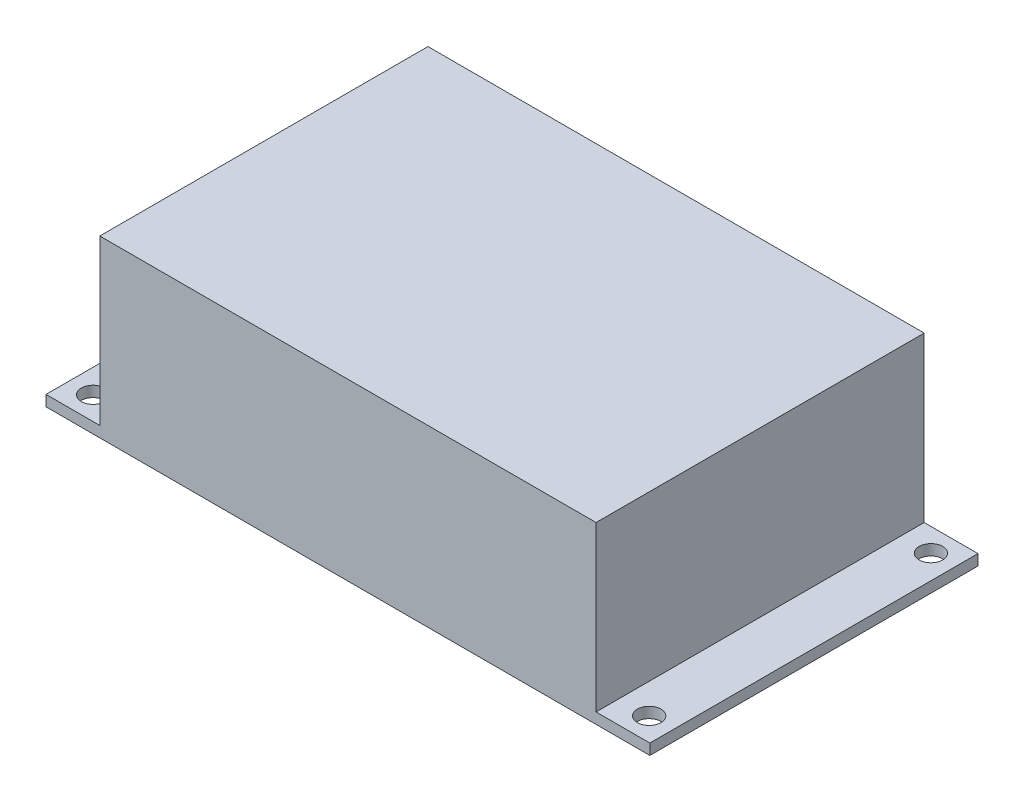
ISO-10303-21;
HEADER;
FILE_DESCRIPTION(('STEP AP214'),'2;1');
FILE_NAME('part.step','',(''),(''),'','','');
FILE_SCHEMA(('AUTOMOTIVE_DESIGN { 1 0 10303 214 1 1 1 1 }'));
ENDSEC;
DATA;
#1=APPLICATION_CONTEXT('core data for automotive mechanical design processes');
#2=APPLICATION_PROTOCOL_DEFINITION('international standard','automotive_design',2000,#1);
#3=PRODUCT_CONTEXT('',#1,'mechanical');
#4=PRODUCT('Part','Part','',(#3));
#5=PRODUCT_RELATED_PRODUCT_CATEGORY('part','',(#4));
#6=PRODUCT_DEFINITION_FORMATION('','',#4);
#7=PRODUCT_DEFINITION_CONTEXT('part definition',#1,'design');
#8=PRODUCT_DEFINITION('design','',#6,#7);
#9=PRODUCT_DEFINITION_SHAPE('','',#8);
#10=(LENGTH_UNIT() NAMED_UNIT(*) SI_UNIT(.MILLI.,.METRE.));
#11=(NAMED_UNIT(*) PLANE_ANGLE_UNIT() SI_UNIT($,.RADIAN.));
#12=(NAMED_UNIT(*) SI_UNIT($,.STERADIAN.) SOLID_ANGLE_UNIT());
#13=UNCERTAINTY_MEASURE_WITH_UNIT(LENGTH_MEASURE(1.E-05),#10,'distance_accuracy_value','');
#14=(GEOMETRIC_REPRESENTATION_CONTEXT(3) GLOBAL_UNCERTAINTY_ASSIGNED_CONTEXT((#13)) GLOBAL_UNIT_ASSIGNED_CONTEXT((#10,
#11,#12)) REPRESENTATION_CONTEXT('',''));
#15=CARTESIAN_POINT('',(0.,0.,0.));
#16=DIRECTION('',(0.,0.,1.));
#17=DIRECTION('',(1.,0.,0.));
#18=AXIS2_PLACEMENT_3D('',#15,#16,#17);
#19=CARTESIAN_POINT('',(0.,1.6,0.));
#20=DIRECTION('',(0.,1.,0.));
#21=DIRECTION('',(0.,0.,1.));
#22=AXIS2_PLACEMENT_3D('',#19,#20,#21);
#23=PLANE('',#22);
#24=DIRECTION('',(0.,0.,1.));
#25=VECTOR('',#24,1.);
#26=CARTESIAN_POINT('',(-36.9,1.6,-24.4));
#27=LINE('',#26,#25);
#28=CARTESIAN_POINT('',(-36.9,1.6,-24.4));
#29=VERTEX_POINT('',#28);
#30=CARTESIAN_POINT('',(-36.9,1.6,24.4));
#31=VERTEX_POINT('',#30);
#32=EDGE_CURVE('E51',#29,#31,#27,.T.);
#33=ORIENTED_EDGE('',*,*,#32,.F.);
#34=DIRECTION('',(-1.,0.,0.));
#35=VECTOR('',#34,1.);
#36=CARTESIAN_POINT('',(-44.9,1.6,-24.4));
#37=LINE('',#36,#35);
#38=CARTESIAN_POINT('',(-44.9,1.6,-24.4));
#39=VERTEX_POINT('',#38);
#40=EDGE_CURVE('E188',#29,#39,#37,.T.);
#41=ORIENTED_EDGE('',*,*,#40,.T.);
#42=DIRECTION('',(0.,0.,1.));
#43=VECTOR('',#42,1.);
#44=CARTESIAN_POINT('',(-44.9,1.6,-24.4));
#45=LINE('',#44,#43);
#46=CARTESIAN_POINT('',(-44.9,1.6,24.4));
#47=VERTEX_POINT('',#46);
#48=EDGE_CURVE('E155',#39,#47,#45,.T.);
#49=ORIENTED_EDGE('',*,*,#48,.T.);
#50=DIRECTION('',(1.,0.,0.));
#51=VECTOR('',#50,1.);
#52=CARTESIAN_POINT('',(-44.9,1.6,24.4));
#53=LINE('',#52,#51);
#54=EDGE_CURVE('E168',#47,#31,#53,.T.);
#55=ORIENTED_EDGE('',*,*,#54,.T.);
#56=EDGE_LOOP('',(#33,#41,#49,#55));
#57=FACE_BOUND('',#56,.T.);
#58=CARTESIAN_POINT('',(-41.35,1.6,-20.95));
#59=DIRECTION('',(0.,1.,0.));
#60=DIRECTION('',(0.,0.,1.));
#61=AXIS2_PLACEMENT_3D('',#58,#59,#60);
#62=CIRCLE('',#61,1.75);
#63=CARTESIAN_POINT('',(-41.35,1.6,-19.2));
#64=VERTEX_POINT('',#63);
#65=EDGE_CURVE('E146',#64,#64,#62,.T.);
#66=ORIENTED_EDGE('',*,*,#65,.F.);
#67=EDGE_LOOP('',(#66));
#68=FACE_BOUND('',#67,.T.);
#69=CARTESIAN_POINT('',(-41.35,1.6,20.95));
#70=DIRECTION('',(0.,1.,0.));
#71=DIRECTION('',(0.,0.,-1.));
#72=AXIS2_PLACEMENT_3D('',#69,#70,#71);
#73=CIRCLE('',#72,1.75);
#74=CARTESIAN_POINT('',(-41.35,1.6,19.2));
#75=VERTEX_POINT('',#74);
#76=EDGE_CURVE('E140',#75,#75,#73,.T.);
#77=ORIENTED_EDGE('',*,*,#76,.F.);
#78=EDGE_LOOP('',(#77));
#79=FACE_BOUND('',#78,.T.);
#80=ADVANCED_FACE('F34',(#57,#68,#79),#23,.T.);
#81=CARTESIAN_POINT('',(-44.9,1.6,-24.4));
#82=DIRECTION('',(1.,0.,0.));
#83=DIRECTION('',(0.,0.,-1.));
#84=AXIS2_PLACEMENT_3D('',#81,#82,#83);
#85=PLANE('',#84);
#86=DIRECTION('',(0.,0.,1.));
#87=VECTOR('',#86,1.);
#88=CARTESIAN_POINT('',(-44.9,0.,-24.4));
#89=LINE('',#88,#87);
#90=CARTESIAN_POINT('',(-44.9,0.,-24.4));
#91=VERTEX_POINT('',#90);
#92=CARTESIAN_POINT('',(-44.9,0.,24.4));
#93=VERTEX_POINT('',#92);
#94=EDGE_CURVE('E152',#91,#93,#89,.T.);
#95=ORIENTED_EDGE('',*,*,#94,.T.);
#96=DIRECTION('',(0.,-1.,0.));
#97=VECTOR('',#96,1.);
#98=CARTESIAN_POINT('',(-44.9,1.6,24.4));
#99=LINE('',#98,#97);
#100=EDGE_CURVE('E12',#47,#93,#99,.T.);
#101=ORIENTED_EDGE('',*,*,#100,.F.);
#102=ORIENTED_EDGE('',*,*,#48,.F.);
#103=DIRECTION('',(0.,-1.,0.));
#104=VECTOR('',#103,1.);
#105=CARTESIAN_POINT('',(-44.9,1.6,-24.4));
#106=LINE('',#105,#104);
#107=EDGE_CURVE('E175',#39,#91,#106,.T.);
#108=ORIENTED_EDGE('',*,*,#107,.T.);
#109=EDGE_LOOP('',(#95,#101,#102,#108));
#110=FACE_BOUND('',#109,.T.);
#111=ADVANCED_FACE('F36',(#110),#85,.F.);
#112=CARTESIAN_POINT('',(-44.9,1.6,24.4));
#113=DIRECTION('',(0.,0.,-1.));
#114=DIRECTION('',(-1.,0.,0.));
#115=AXIS2_PLACEMENT_3D('',#112,#113,#114);
#116=PLANE('',#115);
#117=DIRECTION('',(1.,0.,0.));
#118=VECTOR('',#117,1.);
#119=CARTESIAN_POINT('',(-44.9,0.,24.4));
#120=LINE('',#119,#118);
#121=CARTESIAN_POINT('',(44.9,0.,24.4));
#122=VERTEX_POINT('',#121);
#123=EDGE_CURVE('E182',#93,#122,#120,.T.);
#124=ORIENTED_EDGE('',*,*,#123,.T.);
#125=DIRECTION('',(0.,-1.,0.));
#126=VECTOR('',#125,1.);
#127=CARTESIAN_POINT('',(44.9,1.6,24.4));
#128=LINE('',#127,#126);
#129=CARTESIAN_POINT('',(44.9,1.6,24.4));
#130=VERTEX_POINT('',#129);
#131=EDGE_CURVE('E43',#130,#122,#128,.T.);
#132=ORIENTED_EDGE('',*,*,#131,.F.);
#133=CARTESIAN_POINT('',(36.9,1.6,24.4));
#134=VERTEX_POINT('',#133);
#135=EDGE_CURVE('E158',#134,#130,#53,.T.);
#136=ORIENTED_EDGE('',*,*,#135,.F.);
#137=DIRECTION('',(0.,-1.,0.));
#138=VECTOR('',#137,1.);
#139=CARTESIAN_POINT('',(36.9,140.475307289661,24.4));
#140=LINE('',#139,#138);
#141=CARTESIAN_POINT('',(36.9,26.,24.4));
#142=VERTEX_POINT('',#141);
#143=EDGE_CURVE('E215',#142,#134,#140,.T.);
#144=ORIENTED_EDGE('',*,*,#143,.F.);
#145=DIRECTION('',(1.,0.,0.));
#146=VECTOR('',#145,1.);
#147=CARTESIAN_POINT('',(-36.9,26.,24.4));
#148=LINE('',#147,#146);
#149=CARTESIAN_POINT('',(-36.9,26.,24.4));
#150=VERTEX_POINT('',#149);
#151=EDGE_CURVE('E122',#150,#142,#148,.T.);
#152=ORIENTED_EDGE('',*,*,#151,.F.);
#153=DIRECTION('',(0.,-1.,0.));
#154=VECTOR('',#153,1.);
#155=CARTESIAN_POINT('',(-36.9,140.475307289661,24.4));
#156=LINE('',#155,#154);
#157=EDGE_CURVE('E208',#150,#31,#156,.T.);
#158=ORIENTED_EDGE('',*,*,#157,.T.);
#159=ORIENTED_EDGE('',*,*,#54,.F.);
#160=ORIENTED_EDGE('',*,*,#100,.T.);
#161=EDGE_LOOP('',(#124,#132,#136,#144,#152,#158,#159,#160));
#162=FACE_BOUND('',#161,.T.);
#163=ADVANCED_FACE('F223',(#162),#116,.F.);
#164=CARTESIAN_POINT('',(44.9,1.6,-24.4));
#165=DIRECTION('',(-1.,0.,0.));
#166=DIRECTION('',(0.,0.,1.));
#167=AXIS2_PLACEMENT_3D('',#164,#165,#166);
#168=PLANE('',#167);
#169=DIRECTION('',(0.,0.,-1.));
#170=VECTOR('',#169,1.);
#171=CARTESIAN_POINT('',(44.9,0.,-24.4));
#172=LINE('',#171,#170);
#173=CARTESIAN_POINT('',(44.9,0.,-24.4));
#174=VERTEX_POINT('',#173);
#175=EDGE_CURVE('E180',#122,#174,#172,.T.);
#176=ORIENTED_EDGE('',*,*,#175,.T.);
#177=DIRECTION('',(0.,-1.,0.));
#178=VECTOR('',#177,1.);
#179=CARTESIAN_POINT('',(44.9,1.6,-24.4));
#180=LINE('',#179,#178);
#181=CARTESIAN_POINT('',(44.9,1.6,-24.4));
#182=VERTEX_POINT('',#181);
#183=EDGE_CURVE('E172',#182,#174,#180,.T.);
#184=ORIENTED_EDGE('',*,*,#183,.F.);
#185=DIRECTION('',(0.,0.,-1.));
#186=VECTOR('',#185,1.);
#187=CARTESIAN_POINT('',(44.9,1.6,-24.4));
#188=LINE('',#187,#186);
#189=EDGE_CURVE('E162',#130,#182,#188,.T.);
#190=ORIENTED_EDGE('',*,*,#189,.F.);
#191=ORIENTED_EDGE('',*,*,#131,.T.);
#192=EDGE_LOOP('',(#176,#184,#190,#191));
#193=FACE_BOUND('',#192,.T.);
#194=ADVANCED_FACE('F196',(#193),#168,.F.);
#195=CARTESIAN_POINT('',(-44.9,1.6,-24.4));
#196=DIRECTION('',(0.,0.,1.));
#197=DIRECTION('',(1.,0.,0.));
#198=AXIS2_PLACEMENT_3D('',#195,#196,#197);
#199=PLANE('',#198);
#200=DIRECTION('',(-1.,0.,0.));
#201=VECTOR('',#200,1.);
#202=CARTESIAN_POINT('',(-44.9,0.,-24.4));
#203=LINE('',#202,#201);
#204=EDGE_CURVE('E159',#174,#91,#203,.T.);
#205=ORIENTED_EDGE('',*,*,#204,.T.);
#206=ORIENTED_EDGE('',*,*,#107,.F.);
#207=ORIENTED_EDGE('',*,*,#40,.F.);
#208=DIRECTION('',(0.,-1.,0.));
#209=VECTOR('',#208,1.);
#210=CARTESIAN_POINT('',(-36.9,140.475307289661,-24.4));
#211=LINE('',#210,#209);
#212=CARTESIAN_POINT('',(-36.9,26.,-24.4));
#213=VERTEX_POINT('',#212);
#214=EDGE_CURVE('E114',#213,#29,#211,.T.);
#215=ORIENTED_EDGE('',*,*,#214,.F.);
#216=DIRECTION('',(-1.,0.,0.));
#217=VECTOR('',#216,1.);
#218=CARTESIAN_POINT('',(-36.9,26.,-24.4));
#219=LINE('',#218,#217);
#220=CARTESIAN_POINT('',(36.9,26.,-24.4));
#221=VERTEX_POINT('',#220);
#222=EDGE_CURVE('E109',#221,#213,#219,.T.);
#223=ORIENTED_EDGE('',*,*,#222,.F.);
#224=DIRECTION('',(0.,-1.,0.));
#225=VECTOR('',#224,1.);
#226=CARTESIAN_POINT('',(36.9,140.475307289661,-24.4));
#227=LINE('',#226,#225);
#228=CARTESIAN_POINT('',(36.9,1.6,-24.4));
#229=VERTEX_POINT('',#228);
#230=EDGE_CURVE('E100',#221,#229,#227,.T.);
#231=ORIENTED_EDGE('',*,*,#230,.T.);
#232=EDGE_CURVE('E178',#182,#229,#37,.T.);
#233=ORIENTED_EDGE('',*,*,#232,.F.);
#234=ORIENTED_EDGE('',*,*,#183,.T.);
#235=EDGE_LOOP('',(#205,#206,#207,#215,#223,#231,#233,#234));
#236=FACE_BOUND('',#235,.T.);
#237=ADVANCED_FACE('F112',(#236),#199,.F.);
#238=DIRECTION('',(0.,0.,-1.));
#239=VECTOR('',#238,1.);
#240=CARTESIAN_POINT('',(36.9,1.6,-24.4));
#241=LINE('',#240,#239);
#242=EDGE_CURVE('E59',#134,#229,#241,.T.);
#243=ORIENTED_EDGE('',*,*,#242,.F.);
#244=ORIENTED_EDGE('',*,*,#135,.T.);
#245=ORIENTED_EDGE('',*,*,#189,.T.);
#246=ORIENTED_EDGE('',*,*,#232,.T.);
#247=EDGE_LOOP('',(#243,#244,#245,#246));
#248=FACE_BOUND('',#247,.T.);
#249=CARTESIAN_POINT('',(41.35,1.6,-20.95));
#250=DIRECTION('',(0.,1.,0.));
#251=DIRECTION('',(0.,0.,-1.));
#252=AXIS2_PLACEMENT_3D('',#249,#250,#251);
#253=CIRCLE('',#252,1.75);
#254=CARTESIAN_POINT('',(41.35,1.6,-22.7));
#255=VERTEX_POINT('',#254);
#256=EDGE_CURVE('E123',#255,#255,#253,.T.);
#257=ORIENTED_EDGE('',*,*,#256,.F.);
#258=EDGE_LOOP('',(#257));
#259=FACE_BOUND('',#258,.T.);
#260=CARTESIAN_POINT('',(41.35,1.6,20.95));
#261=DIRECTION('',(0.,1.,0.));
#262=DIRECTION('',(0.,0.,1.));
#263=AXIS2_PLACEMENT_3D('',#260,#261,#262);
#264=CIRCLE('',#263,1.75);
#265=CARTESIAN_POINT('',(41.35,1.6,22.7));
#266=VERTEX_POINT('',#265);
#267=EDGE_CURVE('E135',#266,#266,#264,.T.);
#268=ORIENTED_EDGE('',*,*,#267,.F.);
#269=EDGE_LOOP('',(#268));
#270=FACE_BOUND('',#269,.T.);
#271=ADVANCED_FACE('F192',(#248,#259,#270),#23,.T.);
#272=CARTESIAN_POINT('',(0.,0.,0.));
#273=DIRECTION('',(0.,1.,0.));
#274=DIRECTION('',(0.,0.,1.));
#275=AXIS2_PLACEMENT_3D('',#272,#273,#274);
#276=PLANE('',#275);
#277=CARTESIAN_POINT('',(41.35,0.,-20.95));
#278=DIRECTION('',(0.,1.,0.));
#279=DIRECTION('',(0.,0.,-1.));
#280=AXIS2_PLACEMENT_3D('',#277,#278,#279);
#281=CIRCLE('',#280,1.75);
#282=CARTESIAN_POINT('',(41.35,0.,-22.7));
#283=VERTEX_POINT('',#282);
#284=EDGE_CURVE('E126',#283,#283,#281,.T.);
#285=ORIENTED_EDGE('',*,*,#284,.T.);
#286=EDGE_LOOP('',(#285));
#287=FACE_BOUND('',#286,.T.);
#288=CARTESIAN_POINT('',(41.35,0.,20.95));
#289=DIRECTION('',(0.,1.,0.));
#290=DIRECTION('',(0.,0.,1.));
#291=AXIS2_PLACEMENT_3D('',#288,#289,#290);
#292=CIRCLE('',#291,1.75);
#293=CARTESIAN_POINT('',(41.35,0.,22.7));
#294=VERTEX_POINT('',#293);
#295=EDGE_CURVE('E137',#294,#294,#292,.T.);
#296=ORIENTED_EDGE('',*,*,#295,.T.);
#297=EDGE_LOOP('',(#296));
#298=FACE_BOUND('',#297,.T.);
#299=CARTESIAN_POINT('',(-41.35,0.,20.95));
#300=DIRECTION('',(0.,1.,0.));
#301=DIRECTION('',(0.,0.,-1.));
#302=AXIS2_PLACEMENT_3D('',#299,#300,#301);
#303=CIRCLE('',#302,1.75);
#304=CARTESIAN_POINT('',(-41.35,0.,19.2));
#305=VERTEX_POINT('',#304);
#306=EDGE_CURVE('E143',#305,#305,#303,.T.);
#307=ORIENTED_EDGE('',*,*,#306,.T.);
#308=EDGE_LOOP('',(#307));
#309=FACE_BOUND('',#308,.T.);
#310=CARTESIAN_POINT('',(-41.35,0.,-20.95));
#311=DIRECTION('',(0.,1.,0.));
#312=DIRECTION('',(0.,0.,1.));
#313=AXIS2_PLACEMENT_3D('',#310,#311,#312);
#314=CIRCLE('',#313,1.75);
#315=CARTESIAN_POINT('',(-41.35,0.,-19.2));
#316=VERTEX_POINT('',#315);
#317=EDGE_CURVE('E149',#316,#316,#314,.T.);
#318=ORIENTED_EDGE('',*,*,#317,.T.);
#319=EDGE_LOOP('',(#318));
#320=FACE_BOUND('',#319,.T.);
#321=ORIENTED_EDGE('',*,*,#94,.F.);
#322=ORIENTED_EDGE('',*,*,#204,.F.);
#323=ORIENTED_EDGE('',*,*,#175,.F.);
#324=ORIENTED_EDGE('',*,*,#123,.F.);
#325=EDGE_LOOP('',(#321,#322,#323,#324));
#326=FACE_BOUND('',#325,.T.);
#327=ADVANCED_FACE('F201',(#287,#298,#309,#320,#326),#276,.F.);
#328=CARTESIAN_POINT('',(-41.35,0.,-20.95));
#329=DIRECTION('',(0.,1.,0.));
#330=DIRECTION('',(0.,0.,1.));
#331=AXIS2_PLACEMENT_3D('',#328,#329,#330);
#332=CYLINDRICAL_SURFACE('',#331,1.75);
#333=ORIENTED_EDGE('',*,*,#317,.F.);
#334=EDGE_LOOP('',(#333));
#335=FACE_BOUND('',#334,.T.);
#336=ORIENTED_EDGE('',*,*,#65,.T.);
#337=EDGE_LOOP('',(#336));
#338=FACE_BOUND('',#337,.T.);
#339=ADVANCED_FACE('F234',(#335,#338),#332,.F.);
#340=CARTESIAN_POINT('',(-41.35,0.,20.95));
#341=DIRECTION('',(0.,1.,0.));
#342=DIRECTION('',(0.,0.,1.));
#343=AXIS2_PLACEMENT_3D('',#340,#341,#342);
#344=CYLINDRICAL_SURFACE('',#343,1.75);
#345=ORIENTED_EDGE('',*,*,#306,.F.);
#346=EDGE_LOOP('',(#345));
#347=FACE_BOUND('',#346,.T.);
#348=ORIENTED_EDGE('',*,*,#76,.T.);
#349=EDGE_LOOP('',(#348));
#350=FACE_BOUND('',#349,.T.);
#351=ADVANCED_FACE('F231',(#347,#350),#344,.F.);
#352=CARTESIAN_POINT('',(41.35,0.,20.95));
#353=DIRECTION('',(0.,1.,0.));
#354=DIRECTION('',(0.,0.,1.));
#355=AXIS2_PLACEMENT_3D('',#352,#353,#354);
#356=CYLINDRICAL_SURFACE('',#355,1.75);
#357=ORIENTED_EDGE('',*,*,#295,.F.);
#358=EDGE_LOOP('',(#357));
#359=FACE_BOUND('',#358,.T.);
#360=ORIENTED_EDGE('',*,*,#267,.T.);
#361=EDGE_LOOP('',(#360));
#362=FACE_BOUND('',#361,.T.);
#363=ADVANCED_FACE('F233',(#359,#362),#356,.F.);
#364=CARTESIAN_POINT('',(41.35,0.,-20.95));
#365=DIRECTION('',(0.,1.,0.));
#366=DIRECTION('',(0.,0.,1.));
#367=AXIS2_PLACEMENT_3D('',#364,#365,#366);
#368=CYLINDRICAL_SURFACE('',#367,1.75);
#369=ORIENTED_EDGE('',*,*,#284,.F.);
#370=EDGE_LOOP('',(#369));
#371=FACE_BOUND('',#370,.T.);
#372=ORIENTED_EDGE('',*,*,#256,.T.);
#373=EDGE_LOOP('',(#372));
#374=FACE_BOUND('',#373,.T.);
#375=ADVANCED_FACE('F241',(#371,#374),#368,.F.);
#376=CARTESIAN_POINT('',(-36.9,140.475307289661,-24.4));
#377=DIRECTION('',(1.,0.,0.));
#378=DIRECTION('',(0.,0.,-1.));
#379=AXIS2_PLACEMENT_3D('',#376,#377,#378);
#380=PLANE('',#379);
#381=DIRECTION('',(0.,0.,1.));
#382=VECTOR('',#381,1.);
#383=CARTESIAN_POINT('',(-36.9,26.,-24.4));
#384=LINE('',#383,#382);
#385=EDGE_CURVE('E118',#213,#150,#384,.T.);
#386=ORIENTED_EDGE('',*,*,#385,.F.);
#387=ORIENTED_EDGE('',*,*,#214,.T.);
#388=ORIENTED_EDGE('',*,*,#32,.T.);
#389=ORIENTED_EDGE('',*,*,#157,.F.);
#390=EDGE_LOOP('',(#386,#387,#388,#389));
#391=FACE_BOUND('',#390,.T.);
#392=ADVANCED_FACE('F206',(#391),#380,.F.);
#393=CARTESIAN_POINT('',(36.9,140.475307289661,-24.4));
#394=DIRECTION('',(-1.,0.,0.));
#395=DIRECTION('',(0.,0.,1.));
#396=AXIS2_PLACEMENT_3D('',#393,#394,#395);
#397=PLANE('',#396);
#398=DIRECTION('',(0.,0.,-1.));
#399=VECTOR('',#398,1.);
#400=CARTESIAN_POINT('',(36.9,26.,-24.4));
#401=LINE('',#400,#399);
#402=EDGE_CURVE('E105',#142,#221,#401,.T.);
#403=ORIENTED_EDGE('',*,*,#402,.F.);
#404=ORIENTED_EDGE('',*,*,#143,.T.);
#405=ORIENTED_EDGE('',*,*,#242,.T.);
#406=ORIENTED_EDGE('',*,*,#230,.F.);
#407=EDGE_LOOP('',(#403,#404,#405,#406));
#408=FACE_BOUND('',#407,.T.);
#409=ADVANCED_FACE('F102',(#408),#397,.F.);
#410=CARTESIAN_POINT('',(0.,26.,0.));
#411=DIRECTION('',(0.,1.,0.));
#412=DIRECTION('',(0.,0.,1.));
#413=AXIS2_PLACEMENT_3D('',#410,#411,#412);
#414=PLANE('',#413);
#415=ORIENTED_EDGE('',*,*,#222,.T.);
#416=ORIENTED_EDGE('',*,*,#385,.T.);
#417=ORIENTED_EDGE('',*,*,#151,.T.);
#418=ORIENTED_EDGE('',*,*,#402,.T.);
#419=EDGE_LOOP('',(#415,#416,#417,#418));
#420=FACE_BOUND('',#419,.T.);
#421=ADVANCED_FACE('F121',(#420),#414,.T.);
#422=CLOSED_SHELL('',(#80,#111,#163,#194,#237,#271,#327,#339,#351,#363,#375,#392,#409,#421));
#423=MANIFOLD_SOLID_BREP('B2',#422);
#424=ADVANCED_BREP_SHAPE_REPRESENTATION('',(#18,#423),#14);
#425=SHAPE_DEFINITION_REPRESENTATION(#9,#424);
ENDSEC;
END-ISO-10303-21;
